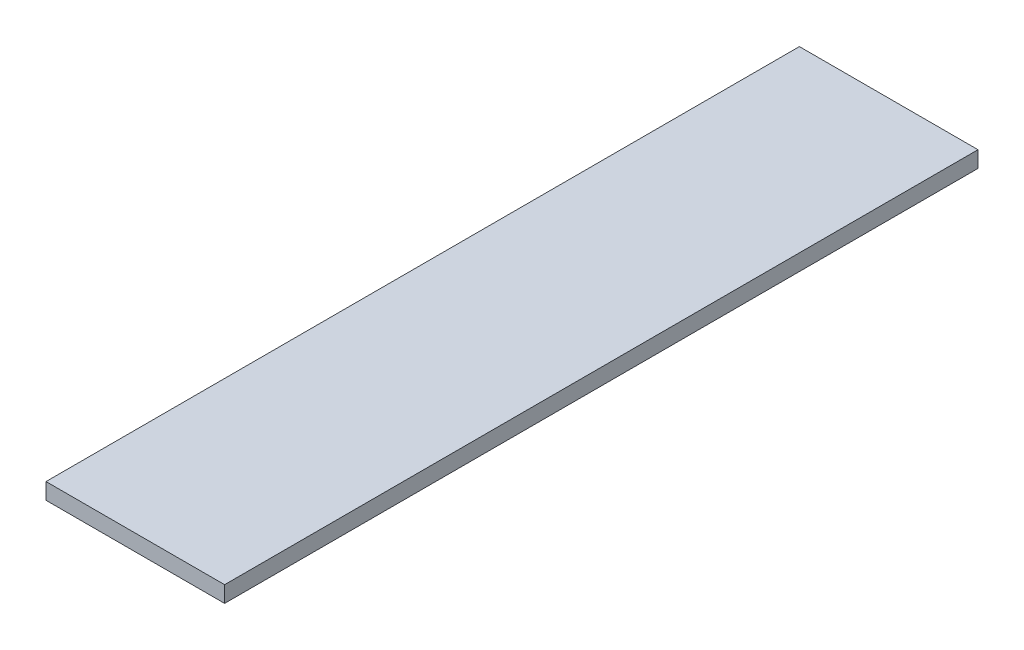
ISO-10303-21;
HEADER;
FILE_DESCRIPTION(('STEP AP214'),'2;1');
FILE_NAME('part.step','',(''),(''),'','','');
FILE_SCHEMA(('AUTOMOTIVE_DESIGN { 1 0 10303 214 1 1 1 1 }'));
ENDSEC;
DATA;
#1=APPLICATION_CONTEXT('core data for automotive mechanical design processes');
#2=APPLICATION_PROTOCOL_DEFINITION('international standard','automotive_design',2000,#1);
#3=PRODUCT_CONTEXT('',#1,'mechanical');
#4=PRODUCT('Part','Part','',(#3));
#5=PRODUCT_RELATED_PRODUCT_CATEGORY('part','',(#4));
#6=PRODUCT_DEFINITION_FORMATION('','',#4);
#7=PRODUCT_DEFINITION_CONTEXT('part definition',#1,'design');
#8=PRODUCT_DEFINITION('design','',#6,#7);
#9=PRODUCT_DEFINITION_SHAPE('','',#8);
#10=(LENGTH_UNIT() NAMED_UNIT(*) SI_UNIT(.MILLI.,.METRE.));
#11=(NAMED_UNIT(*) PLANE_ANGLE_UNIT() SI_UNIT($,.RADIAN.));
#12=(NAMED_UNIT(*) SI_UNIT($,.STERADIAN.) SOLID_ANGLE_UNIT());
#13=UNCERTAINTY_MEASURE_WITH_UNIT(LENGTH_MEASURE(1.E-05),#10,'distance_accuracy_value','');
#14=(GEOMETRIC_REPRESENTATION_CONTEXT(3) GLOBAL_UNCERTAINTY_ASSIGNED_CONTEXT((#13)) GLOBAL_UNIT_ASSIGNED_CONTEXT((#10,
#11,#12)) REPRESENTATION_CONTEXT('',''));
#15=CARTESIAN_POINT('',(0.,0.,0.));
#16=DIRECTION('',(0.,0.,1.));
#17=DIRECTION('',(1.,0.,0.));
#18=AXIS2_PLACEMENT_3D('',#15,#16,#17);
#19=CARTESIAN_POINT('',(0.,0.,294.64));
#20=DIRECTION('',(1.,0.,0.));
#21=DIRECTION('',(0.,0.,-1.));
#22=AXIS2_PLACEMENT_3D('',#19,#20,#21);
#23=PLANE('',#22);
#24=DIRECTION('',(0.,-1.,0.));
#25=VECTOR('',#24,1.);
#26=CARTESIAN_POINT('',(0.,0.,0.));
#27=LINE('',#26,#25);
#28=CARTESIAN_POINT('',(0.,6.35,0.));
#29=VERTEX_POINT('',#28);
#30=CARTESIAN_POINT('',(0.,0.,0.));
#31=VERTEX_POINT('',#30);
#32=EDGE_CURVE('E107',#29,#31,#27,.T.);
#33=ORIENTED_EDGE('',*,*,#32,.T.);
#34=DIRECTION('',(0.,0.,-1.));
#35=VECTOR('',#34,1.);
#36=CARTESIAN_POINT('',(0.,0.,294.64));
#37=LINE('',#36,#35);
#38=CARTESIAN_POINT('',(0.,0.,294.64));
#39=VERTEX_POINT('',#38);
#40=EDGE_CURVE('E11',#39,#31,#37,.T.);
#41=ORIENTED_EDGE('',*,*,#40,.F.);
#42=DIRECTION('',(0.,-1.,0.));
#43=VECTOR('',#42,1.);
#44=CARTESIAN_POINT('',(0.,0.,294.64));
#45=LINE('',#44,#43);
#46=CARTESIAN_POINT('',(0.,6.35,294.64));
#47=VERTEX_POINT('',#46);
#48=EDGE_CURVE('E91',#47,#39,#45,.T.);
#49=ORIENTED_EDGE('',*,*,#48,.F.);
#50=DIRECTION('',(0.,0.,-1.));
#51=VECTOR('',#50,1.);
#52=CARTESIAN_POINT('',(0.,6.35,294.64));
#53=LINE('',#52,#51);
#54=EDGE_CURVE('E103',#47,#29,#53,.T.);
#55=ORIENTED_EDGE('',*,*,#54,.T.);
#56=EDGE_LOOP('',(#33,#41,#49,#55));
#57=FACE_BOUND('',#56,.T.);
#58=ADVANCED_FACE('F39',(#57),#23,.F.);
#59=CARTESIAN_POINT('',(0.,0.,294.64));
#60=DIRECTION('',(0.,1.,0.));
#61=DIRECTION('',(0.,0.,1.));
#62=AXIS2_PLACEMENT_3D('',#59,#60,#61);
#63=PLANE('',#62);
#64=DIRECTION('',(1.,0.,0.));
#65=VECTOR('',#64,1.);
#66=CARTESIAN_POINT('',(0.,0.,0.));
#67=LINE('',#66,#65);
#68=CARTESIAN_POINT('',(69.85,0.,0.));
#69=VERTEX_POINT('',#68);
#70=EDGE_CURVE('E96',#31,#69,#67,.T.);
#71=ORIENTED_EDGE('',*,*,#70,.T.);
#72=DIRECTION('',(0.,0.,-1.));
#73=VECTOR('',#72,1.);
#74=CARTESIAN_POINT('',(69.85,0.,294.64));
#75=LINE('',#74,#73);
#76=CARTESIAN_POINT('',(69.85,0.,294.64));
#77=VERTEX_POINT('',#76);
#78=EDGE_CURVE('E48',#77,#69,#75,.T.);
#79=ORIENTED_EDGE('',*,*,#78,.F.);
#80=DIRECTION('',(1.,0.,0.));
#81=VECTOR('',#80,1.);
#82=CARTESIAN_POINT('',(0.,0.,294.64));
#83=LINE('',#82,#81);
#84=EDGE_CURVE('E86',#39,#77,#83,.T.);
#85=ORIENTED_EDGE('',*,*,#84,.F.);
#86=ORIENTED_EDGE('',*,*,#40,.T.);
#87=EDGE_LOOP('',(#71,#79,#85,#86));
#88=FACE_BOUND('',#87,.T.);
#89=ADVANCED_FACE('F95',(#88),#63,.F.);
#90=CARTESIAN_POINT('',(69.85,0.,294.64));
#91=DIRECTION('',(-1.,0.,0.));
#92=DIRECTION('',(0.,0.,1.));
#93=AXIS2_PLACEMENT_3D('',#90,#91,#92);
#94=PLANE('',#93);
#95=DIRECTION('',(0.,1.,0.));
#96=VECTOR('',#95,1.);
#97=CARTESIAN_POINT('',(69.85,0.,0.));
#98=LINE('',#97,#96);
#99=CARTESIAN_POINT('',(69.85,6.35,0.));
#100=VERTEX_POINT('',#99);
#101=EDGE_CURVE('E73',#69,#100,#98,.T.);
#102=ORIENTED_EDGE('',*,*,#101,.T.);
#103=DIRECTION('',(0.,0.,-1.));
#104=VECTOR('',#103,1.);
#105=CARTESIAN_POINT('',(69.85,6.35,294.64));
#106=LINE('',#105,#104);
#107=CARTESIAN_POINT('',(69.85,6.35,294.64));
#108=VERTEX_POINT('',#107);
#109=EDGE_CURVE('E98',#108,#100,#106,.T.);
#110=ORIENTED_EDGE('',*,*,#109,.F.);
#111=DIRECTION('',(0.,1.,0.));
#112=VECTOR('',#111,1.);
#113=CARTESIAN_POINT('',(69.85,0.,294.64));
#114=LINE('',#113,#112);
#115=EDGE_CURVE('E89',#77,#108,#114,.T.);
#116=ORIENTED_EDGE('',*,*,#115,.F.);
#117=ORIENTED_EDGE('',*,*,#78,.T.);
#118=EDGE_LOOP('',(#102,#110,#116,#117));
#119=FACE_BOUND('',#118,.T.);
#120=ADVANCED_FACE('F99',(#119),#94,.F.);
#121=CARTESIAN_POINT('',(0.,6.35,294.64));
#122=DIRECTION('',(0.,-1.,0.));
#123=DIRECTION('',(0.,0.,-1.));
#124=AXIS2_PLACEMENT_3D('',#121,#122,#123);
#125=PLANE('',#124);
#126=DIRECTION('',(-1.,0.,0.));
#127=VECTOR('',#126,1.);
#128=CARTESIAN_POINT('',(0.,6.35,0.));
#129=LINE('',#128,#127);
#130=EDGE_CURVE('E79',#100,#29,#129,.T.);
#131=ORIENTED_EDGE('',*,*,#130,.T.);
#132=ORIENTED_EDGE('',*,*,#54,.F.);
#133=DIRECTION('',(-1.,0.,0.));
#134=VECTOR('',#133,1.);
#135=CARTESIAN_POINT('',(0.,6.35,294.64));
#136=LINE('',#135,#134);
#137=EDGE_CURVE('E56',#108,#47,#136,.T.);
#138=ORIENTED_EDGE('',*,*,#137,.F.);
#139=ORIENTED_EDGE('',*,*,#109,.T.);
#140=EDGE_LOOP('',(#131,#132,#138,#139));
#141=FACE_BOUND('',#140,.T.);
#142=ADVANCED_FACE('F120',(#141),#125,.F.);
#143=CARTESIAN_POINT('',(0.,0.,294.64));
#144=DIRECTION('',(0.,0.,-1.));
#145=DIRECTION('',(-1.,0.,0.));
#146=AXIS2_PLACEMENT_3D('',#143,#144,#145);
#147=PLANE('',#146);
#148=ORIENTED_EDGE('',*,*,#48,.T.);
#149=ORIENTED_EDGE('',*,*,#84,.T.);
#150=ORIENTED_EDGE('',*,*,#115,.T.);
#151=ORIENTED_EDGE('',*,*,#137,.T.);
#152=EDGE_LOOP('',(#148,#149,#150,#151));
#153=FACE_BOUND('',#152,.T.);
#154=ADVANCED_FACE('F87',(#153),#147,.F.);
#155=CARTESIAN_POINT('',(0.,0.,0.));
#156=DIRECTION('',(0.,0.,-1.));
#157=DIRECTION('',(-1.,0.,0.));
#158=AXIS2_PLACEMENT_3D('',#155,#156,#157);
#159=PLANE('',#158);
#160=ORIENTED_EDGE('',*,*,#32,.F.);
#161=ORIENTED_EDGE('',*,*,#130,.F.);
#162=ORIENTED_EDGE('',*,*,#101,.F.);
#163=ORIENTED_EDGE('',*,*,#70,.F.);
#164=EDGE_LOOP('',(#160,#161,#162,#163));
#165=FACE_BOUND('',#164,.T.);
#166=ADVANCED_FACE('F123',(#165),#159,.T.);
#167=CLOSED_SHELL('',(#58,#89,#120,#142,#154,#166));
#168=MANIFOLD_SOLID_BREP('B2',#167);
#169=ADVANCED_BREP_SHAPE_REPRESENTATION('',(#18,#168),#14);
#170=SHAPE_DEFINITION_REPRESENTATION(#9,#169);
ENDSEC;
END-ISO-10303-21;
